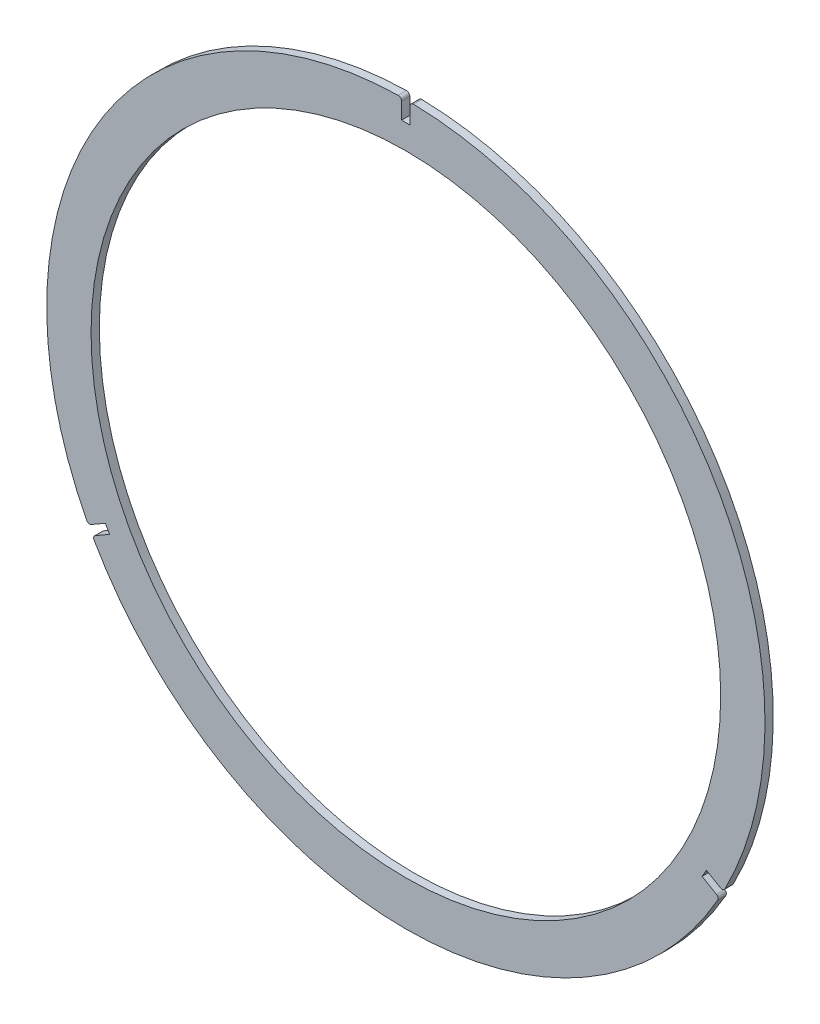
ISO-10303-21;
HEADER;
FILE_DESCRIPTION(('STEP AP214'),'2;1');
FILE_NAME('part.step','',(''),(''),'','','');
FILE_SCHEMA(('AUTOMOTIVE_DESIGN { 1 0 10303 214 1 1 1 1 }'));
ENDSEC;
DATA;
#1=APPLICATION_CONTEXT('core data for automotive mechanical design processes');
#2=APPLICATION_PROTOCOL_DEFINITION('international standard','automotive_design',2000,#1);
#3=PRODUCT_CONTEXT('',#1,'mechanical');
#4=PRODUCT('Part','Part','',(#3));
#5=PRODUCT_RELATED_PRODUCT_CATEGORY('part','',(#4));
#6=PRODUCT_DEFINITION_FORMATION('','',#4);
#7=PRODUCT_DEFINITION_CONTEXT('part definition',#1,'design');
#8=PRODUCT_DEFINITION('design','',#6,#7);
#9=PRODUCT_DEFINITION_SHAPE('','',#8);
#10=(LENGTH_UNIT() NAMED_UNIT(*) SI_UNIT(.MILLI.,.METRE.));
#11=(NAMED_UNIT(*) PLANE_ANGLE_UNIT() SI_UNIT($,.RADIAN.));
#12=(NAMED_UNIT(*) SI_UNIT($,.STERADIAN.) SOLID_ANGLE_UNIT());
#13=UNCERTAINTY_MEASURE_WITH_UNIT(LENGTH_MEASURE(1.E-05),#10,'distance_accuracy_value','');
#14=(GEOMETRIC_REPRESENTATION_CONTEXT(3) GLOBAL_UNCERTAINTY_ASSIGNED_CONTEXT((#13)) GLOBAL_UNIT_ASSIGNED_CONTEXT((#10,
#11,#12)) REPRESENTATION_CONTEXT('',''));
#15=CARTESIAN_POINT('',(0.,0.,0.));
#16=DIRECTION('',(0.,0.,1.));
#17=DIRECTION('',(1.,0.,0.));
#18=AXIS2_PLACEMENT_3D('',#15,#16,#17);
#19=CARTESIAN_POINT('',(8.11058620369085,14.0356499804915,1.5875));
#20=DIRECTION('',(-0.500328450143991,-0.865835689941522,0.));
#21=DIRECTION('',(0.865835689941523,-0.500328450143991,0.));
#22=AXIS2_PLACEMENT_3D('',#19,#20,#21);
#23=PLANE('',#22);
#24=DIRECTION('',(-0.865835689941523,0.500328450143991,0.));
#25=VECTOR('',#24,1.);
#26=CARTESIAN_POINT('',(8.11058620369085,14.0356499804915,-1.5875));
#27=LINE('',#26,#25);
#28=CARTESIAN_POINT('',(120.793813473381,-51.0790422319244,-1.5875));
#29=VERTEX_POINT('',#28);
#30=CARTESIAN_POINT('',(115.417559620864,-47.9723410542541,-1.5875));
#31=VERTEX_POINT('',#30);
#32=EDGE_CURVE('E219',#29,#31,#27,.T.);
#33=ORIENTED_EDGE('',*,*,#32,.F.);
#34=DIRECTION('',(0.,0.,1.));
#35=VECTOR('',#34,1.);
#36=CARTESIAN_POINT('',(120.793813473381,-51.0790422319244,1.5875));
#37=LINE('',#36,#35);
#38=CARTESIAN_POINT('',(120.793813473381,-51.0790422319244,1.5875));
#39=VERTEX_POINT('',#38);
#40=EDGE_CURVE('E301',#29,#39,#37,.T.);
#41=ORIENTED_EDGE('',*,*,#40,.T.);
#42=DIRECTION('',(-0.865835689941523,0.500328450143991,0.));
#43=VECTOR('',#42,1.);
#44=CARTESIAN_POINT('',(8.11058620369085,14.0356499804915,1.5875));
#45=LINE('',#44,#43);
#46=CARTESIAN_POINT('',(115.417559620864,-47.9723410542541,1.5875));
#47=VERTEX_POINT('',#46);
#48=EDGE_CURVE('E358',#39,#47,#45,.T.);
#49=ORIENTED_EDGE('',*,*,#48,.T.);
#50=DIRECTION('',(0.,0.,-1.));
#51=VECTOR('',#50,1.);
#52=CARTESIAN_POINT('',(115.417559620864,-47.9723410542541,1.5875));
#53=LINE('',#52,#51);
#54=EDGE_CURVE('E215',#47,#31,#53,.T.);
#55=ORIENTED_EDGE('',*,*,#54,.T.);
#56=EDGE_LOOP('',(#33,#41,#49,#55));
#57=FACE_BOUND('',#56,.T.);
#58=ADVANCED_FACE('F39',(#57),#23,.T.);
#59=CARTESIAN_POINT('',(0.,12.7,1.5875));
#60=DIRECTION('',(0.,0.,-1.));
#61=DIRECTION('',(-1.,0.,0.));
#62=AXIS2_PLACEMENT_3D('',#59,#60,#61);
#63=CYLINDRICAL_SURFACE('',#62,137.922);
#64=CARTESIAN_POINT('',(0.,12.7,1.5875));
#65=DIRECTION('',(0.,0.,1.));
#66=DIRECTION('',(1.,0.,0.));
#67=AXIS2_PLACEMENT_3D('',#64,#65,#66);
#68=CIRCLE('',#67,137.922);
#69=CARTESIAN_POINT('',(122.557755053066,-50.5619534977591,1.5875));
#70=VERTEX_POINT('',#69);
#71=CARTESIAN_POINT('',(2.9481468401487,150.590487395646,1.5875));
#72=VERTEX_POINT('',#71);
#73=EDGE_CURVE('E188',#70,#72,#68,.T.);
#74=ORIENTED_EDGE('',*,*,#73,.F.);
#75=DIRECTION('',(0.,0.,-1.));
#76=VECTOR('',#75,1.);
#77=CARTESIAN_POINT('',(122.557755053066,-50.5619534977591,1.5875));
#78=LINE('',#77,#76);
#79=CARTESIAN_POINT('',(122.557755053066,-50.5619534977591,-1.5875));
#80=VERTEX_POINT('',#79);
#81=EDGE_CURVE('E298',#70,#80,#78,.T.);
#82=ORIENTED_EDGE('',*,*,#81,.T.);
#83=CARTESIAN_POINT('',(0.,12.7,-1.5875));
#84=DIRECTION('',(0.,0.,1.));
#85=DIRECTION('',(1.,0.,0.));
#86=AXIS2_PLACEMENT_3D('',#83,#84,#85);
#87=CIRCLE('',#86,137.922);
#88=CARTESIAN_POINT('',(2.9481468401487,150.590487395646,-1.5875));
#89=VERTEX_POINT('',#88);
#90=EDGE_CURVE('E221',#80,#89,#87,.T.);
#91=ORIENTED_EDGE('',*,*,#90,.T.);
#92=DIRECTION('',(0.,0.,-1.));
#93=VECTOR('',#92,1.);
#94=CARTESIAN_POINT('',(2.9481468401487,150.590487395646,1.5875));
#95=LINE('',#94,#93);
#96=EDGE_CURVE('E296',#89,#72,#95,.F.);
#97=ORIENTED_EDGE('',*,*,#96,.T.);
#98=EDGE_LOOP('',(#74,#82,#91,#97));
#99=FACE_BOUND('',#98,.T.);
#100=ADVANCED_FACE('F378',(#99),#63,.T.);
#101=CARTESIAN_POINT('',(1.651,0.,1.5875));
#102=DIRECTION('',(-1.,0.,0.));
#103=DIRECTION('',(0.,-1.,0.));
#104=AXIS2_PLACEMENT_3D('',#101,#102,#103);
#105=PLANE('',#104);
#106=DIRECTION('',(0.,1.,0.));
#107=VECTOR('',#106,1.);
#108=CARTESIAN_POINT('',(1.651,0.,1.5875));
#109=LINE('',#108,#107);
#110=CARTESIAN_POINT('',(1.651,142.992117970104,1.5875));
#111=VERTEX_POINT('',#110);
#112=CARTESIAN_POINT('',(1.651,149.320777566957,1.5875));
#113=VERTEX_POINT('',#112);
#114=EDGE_CURVE('E169',#111,#113,#109,.T.);
#115=ORIENTED_EDGE('',*,*,#114,.T.);
#116=DIRECTION('',(0.,0.,1.));
#117=VECTOR('',#116,1.);
#118=CARTESIAN_POINT('',(1.651,149.320777566957,-1.5875));
#119=LINE('',#118,#117);
#120=CARTESIAN_POINT('',(1.651,149.320777566957,-1.5875));
#121=VERTEX_POINT('',#120);
#122=EDGE_CURVE('E47',#113,#121,#119,.F.);
#123=ORIENTED_EDGE('',*,*,#122,.T.);
#124=DIRECTION('',(0.,1.,0.));
#125=VECTOR('',#124,1.);
#126=CARTESIAN_POINT('',(1.651,0.,-1.5875));
#127=LINE('',#126,#125);
#128=CARTESIAN_POINT('',(1.651,142.992117970104,-1.5875));
#129=VERTEX_POINT('',#128);
#130=EDGE_CURVE('E172',#129,#121,#127,.T.);
#131=ORIENTED_EDGE('',*,*,#130,.F.);
#132=DIRECTION('',(0.,0.,-1.));
#133=VECTOR('',#132,1.);
#134=CARTESIAN_POINT('',(1.651,142.992117970104,1.5875));
#135=LINE('',#134,#133);
#136=EDGE_CURVE('E165',#111,#129,#135,.T.);
#137=ORIENTED_EDGE('',*,*,#136,.F.);
#138=EDGE_LOOP('',(#115,#123,#131,#137));
#139=FACE_BOUND('',#138,.T.);
#140=ADVANCED_FACE('F167',(#139),#105,.T.);
#141=CARTESIAN_POINT('',(0.,142.992117970104,1.5875));
#142=DIRECTION('',(0.,1.,0.));
#143=DIRECTION('',(0.,0.,1.));
#144=AXIS2_PLACEMENT_3D('',#141,#142,#143);
#145=PLANE('',#144);
#146=DIRECTION('',(1.,0.,0.));
#147=VECTOR('',#146,1.);
#148=CARTESIAN_POINT('',(0.,142.992117970104,-1.5875));
#149=LINE('',#148,#147);
#150=CARTESIAN_POINT('',(-1.651,142.992117970104,-1.5875));
#151=VERTEX_POINT('',#150);
#152=EDGE_CURVE('E225',#151,#129,#149,.T.);
#153=ORIENTED_EDGE('',*,*,#152,.F.);
#154=DIRECTION('',(0.,0.,-1.));
#155=VECTOR('',#154,1.);
#156=CARTESIAN_POINT('',(-1.651,142.992117970104,1.5875));
#157=LINE('',#156,#155);
#158=CARTESIAN_POINT('',(-1.651,142.992117970104,1.5875));
#159=VERTEX_POINT('',#158);
#160=EDGE_CURVE('E178',#159,#151,#157,.T.);
#161=ORIENTED_EDGE('',*,*,#160,.F.);
#162=DIRECTION('',(1.,0.,0.));
#163=VECTOR('',#162,1.);
#164=CARTESIAN_POINT('',(0.,142.992117970104,1.5875));
#165=LINE('',#164,#163);
#166=EDGE_CURVE('E184',#159,#111,#165,.T.);
#167=ORIENTED_EDGE('',*,*,#166,.T.);
#168=ORIENTED_EDGE('',*,*,#136,.T.);
#169=EDGE_LOOP('',(#153,#161,#167,#168));
#170=FACE_BOUND('',#169,.T.);
#171=ADVANCED_FACE('F190',(#170),#145,.T.);
#172=CARTESIAN_POINT('',(-1.651,0.,1.5875));
#173=DIRECTION('',(-1.,0.,0.));
#174=DIRECTION('',(0.,-1.,0.));
#175=AXIS2_PLACEMENT_3D('',#172,#173,#174);
#176=PLANE('',#175);
#177=DIRECTION('',(0.,1.,0.));
#178=VECTOR('',#177,1.);
#179=CARTESIAN_POINT('',(-1.651,0.,-1.5875));
#180=LINE('',#179,#178);
#181=CARTESIAN_POINT('',(-1.651,149.320777566957,-1.5875));
#182=VERTEX_POINT('',#181);
#183=EDGE_CURVE('E227',#151,#182,#180,.T.);
#184=ORIENTED_EDGE('',*,*,#183,.T.);
#185=DIRECTION('',(0.,0.,-1.));
#186=VECTOR('',#185,1.);
#187=CARTESIAN_POINT('',(-1.651,149.320777566957,1.5875));
#188=LINE('',#187,#186);
#189=CARTESIAN_POINT('',(-1.651,149.320777566957,1.5875));
#190=VERTEX_POINT('',#189);
#191=EDGE_CURVE('E11',#182,#190,#188,.F.);
#192=ORIENTED_EDGE('',*,*,#191,.T.);
#193=DIRECTION('',(0.,1.,0.));
#194=VECTOR('',#193,1.);
#195=CARTESIAN_POINT('',(-1.651,0.,1.5875));
#196=LINE('',#195,#194);
#197=EDGE_CURVE('E192',#159,#190,#196,.T.);
#198=ORIENTED_EDGE('',*,*,#197,.F.);
#199=ORIENTED_EDGE('',*,*,#160,.T.);
#200=EDGE_LOOP('',(#184,#192,#198,#199));
#201=FACE_BOUND('',#200,.T.);
#202=ADVANCED_FACE('F313',(#201),#176,.F.);
#203=CARTESIAN_POINT('',(0.,12.7,1.5875));
#204=DIRECTION('',(0.,0.,-1.));
#205=DIRECTION('',(-1.,0.,0.));
#206=AXIS2_PLACEMENT_3D('',#203,#204,#205);
#207=CYLINDRICAL_SURFACE('',#206,137.922);
#208=CARTESIAN_POINT('',(0.,12.7,-1.5875));
#209=DIRECTION('',(0.,0.,1.));
#210=DIRECTION('',(1.,0.,0.));
#211=AXIS2_PLACEMENT_3D('',#208,#209,#210);
#212=CIRCLE('',#211,137.922);
#213=CARTESIAN_POINT('',(-2.9481468401487,150.590487395646,-1.5875));
#214=VERTEX_POINT('',#213);
#215=CARTESIAN_POINT('',(-122.560886296472,-50.5558869530989,-1.5875));
#216=VERTEX_POINT('',#215);
#217=EDGE_CURVE('E230',#214,#216,#212,.T.);
#218=ORIENTED_EDGE('',*,*,#217,.T.);
#219=DIRECTION('',(0.,0.,-1.));
#220=VECTOR('',#219,1.);
#221=CARTESIAN_POINT('',(-122.560886296472,-50.5558869530989,1.5875));
#222=LINE('',#221,#220);
#223=CARTESIAN_POINT('',(-122.560886296472,-50.5558869530989,1.5875));
#224=VERTEX_POINT('',#223);
#225=EDGE_CURVE('E278',#216,#224,#222,.F.);
#226=ORIENTED_EDGE('',*,*,#225,.T.);
#227=CARTESIAN_POINT('',(0.,12.7,1.5875));
#228=DIRECTION('',(0.,0.,1.));
#229=DIRECTION('',(1.,0.,0.));
#230=AXIS2_PLACEMENT_3D('',#227,#228,#229);
#231=CIRCLE('',#230,137.922);
#232=CARTESIAN_POINT('',(-2.9481468401487,150.590487395646,1.5875));
#233=VERTEX_POINT('',#232);
#234=EDGE_CURVE('E194',#233,#224,#231,.T.);
#235=ORIENTED_EDGE('',*,*,#234,.F.);
#236=DIRECTION('',(0.,0.,-1.));
#237=VECTOR('',#236,1.);
#238=CARTESIAN_POINT('',(-2.9481468401487,150.590487395646,1.5875));
#239=LINE('',#238,#237);
#240=EDGE_CURVE('E275',#233,#214,#239,.T.);
#241=ORIENTED_EDGE('',*,*,#240,.T.);
#242=EDGE_LOOP('',(#218,#226,#235,#241));
#243=FACE_BOUND('',#242,.T.);
#244=ADVANCED_FACE('F320',(#243),#207,.T.);
#245=CARTESIAN_POINT('',(-8.109964379267,14.0362122157648,1.5875));
#246=DIRECTION('',(0.500284668198708,-0.865860988129913,0.));
#247=DIRECTION('',(0.865860988129913,0.500284668198708,0.));
#248=AXIS2_PLACEMENT_3D('',#245,#246,#247);
#249=PLANE('',#248);
#250=DIRECTION('',(-0.865860988129913,-0.500284668198708,0.));
#251=VECTOR('',#250,1.);
#252=CARTESIAN_POINT('',(-8.109964379267,14.0362122157648,1.5875));
#253=LINE('',#252,#251);
#254=CARTESIAN_POINT('',(-115.420556309738,-47.9666319060074,1.5875));
#255=VERTEX_POINT('',#254);
#256=CARTESIAN_POINT('',(-120.796971487045,-51.0730636773324,1.5875));
#257=VERTEX_POINT('',#256);
#258=EDGE_CURVE('E199',#255,#257,#253,.T.);
#259=ORIENTED_EDGE('',*,*,#258,.T.);
#260=DIRECTION('',(0.,0.,1.));
#261=VECTOR('',#260,1.);
#262=CARTESIAN_POINT('',(-120.796971487045,-51.0730636773324,-1.5875));
#263=LINE('',#262,#261);
#264=CARTESIAN_POINT('',(-120.796971487045,-51.0730636773324,-1.5875));
#265=VERTEX_POINT('',#264);
#266=EDGE_CURVE('E177',#257,#265,#263,.F.);
#267=ORIENTED_EDGE('',*,*,#266,.T.);
#268=DIRECTION('',(-0.865860988129913,-0.500284668198708,0.));
#269=VECTOR('',#268,1.);
#270=CARTESIAN_POINT('',(-8.109964379267,14.0362122157648,-1.5875));
#271=LINE('',#270,#269);
#272=CARTESIAN_POINT('',(-115.420556309738,-47.9666319060074,-1.5875));
#273=VERTEX_POINT('',#272);
#274=EDGE_CURVE('E233',#273,#265,#271,.T.);
#275=ORIENTED_EDGE('',*,*,#274,.F.);
#276=DIRECTION('',(0.,0.,-1.));
#277=VECTOR('',#276,1.);
#278=CARTESIAN_POINT('',(-115.420556309738,-47.9666319060074,1.5875));
#279=LINE('',#278,#277);
#280=EDGE_CURVE('E258',#255,#273,#279,.T.);
#281=ORIENTED_EDGE('',*,*,#280,.F.);
#282=EDGE_LOOP('',(#259,#267,#275,#281));
#283=FACE_BOUND('',#282,.T.);
#284=ADVANCED_FACE('F327',(#283),#249,.T.);
#285=CARTESIAN_POINT('',(-107.310591930471,-62.0028441217715,1.5875));
#286=DIRECTION('',(0.865860988129916,0.500284668198702,0.));
#287=DIRECTION('',(-0.500284668198702,0.865860988129916,0.));
#288=AXIS2_PLACEMENT_3D('',#285,#286,#287);
#289=PLANE('',#288);
#290=DIRECTION('',(0.500284668198702,-0.865860988129916,0.));
#291=VECTOR('',#290,1.);
#292=CARTESIAN_POINT('',(-107.310591930471,-62.0028441217715,-1.5875));
#293=LINE('',#292,#291);
#294=CARTESIAN_POINT('',(-113.768616335346,-50.8257048888123,-1.5875));
#295=VERTEX_POINT('',#294);
#296=EDGE_CURVE('E236',#273,#295,#293,.T.);
#297=ORIENTED_EDGE('',*,*,#296,.T.);
#298=DIRECTION('',(0.,0.,-1.));
#299=VECTOR('',#298,1.);
#300=CARTESIAN_POINT('',(-113.768616335346,-50.8257048888123,1.5875));
#301=LINE('',#300,#299);
#302=CARTESIAN_POINT('',(-113.768616335346,-50.8257048888123,1.5875));
#303=VERTEX_POINT('',#302);
#304=EDGE_CURVE('E255',#303,#295,#301,.T.);
#305=ORIENTED_EDGE('',*,*,#304,.F.);
#306=DIRECTION('',(0.500284668198702,-0.865860988129916,0.));
#307=VECTOR('',#306,1.);
#308=CARTESIAN_POINT('',(-107.310591930471,-62.0028441217715,1.5875));
#309=LINE('',#308,#307);
#310=EDGE_CURVE('E202',#255,#303,#309,.T.);
#311=ORIENTED_EDGE('',*,*,#310,.F.);
#312=ORIENTED_EDGE('',*,*,#280,.T.);
#313=EDGE_LOOP('',(#297,#305,#311,#312));
#314=FACE_BOUND('',#313,.T.);
#315=ADVANCED_FACE('F333',(#314),#289,.F.);
#316=CARTESIAN_POINT('',(-6.45802440487518,11.1771392329602,1.5875));
#317=DIRECTION('',(0.500284668198711,-0.865860988129911,0.));
#318=DIRECTION('',(0.865860988129911,0.500284668198711,0.));
#319=AXIS2_PLACEMENT_3D('',#316,#317,#318);
#320=PLANE('',#319);
#321=DIRECTION('',(-0.865860988129911,-0.500284668198711,0.));
#322=VECTOR('',#321,1.);
#323=CARTESIAN_POINT('',(-6.45802440487518,11.1771392329602,-1.5875));
#324=LINE('',#323,#322);
#325=CARTESIAN_POINT('',(-119.277005673374,-54.008389834853,-1.5875));
#326=VERTEX_POINT('',#325);
#327=EDGE_CURVE('E239',#295,#326,#324,.T.);
#328=ORIENTED_EDGE('',*,*,#327,.T.);
#329=DIRECTION('',(0.,0.,-1.));
#330=VECTOR('',#329,1.);
#331=CARTESIAN_POINT('',(-119.277005673374,-54.008389834853,1.5875));
#332=LINE('',#331,#330);
#333=CARTESIAN_POINT('',(-119.277005673374,-54.008389834853,1.5875));
#334=VERTEX_POINT('',#333);
#335=EDGE_CURVE('E294',#326,#334,#332,.F.);
#336=ORIENTED_EDGE('',*,*,#335,.T.);
#337=DIRECTION('',(-0.865860988129911,-0.500284668198711,0.));
#338=VECTOR('',#337,1.);
#339=CARTESIAN_POINT('',(-6.45802440487518,11.1771392329602,1.5875));
#340=LINE('',#339,#338);
#341=EDGE_CURVE('E205',#303,#334,#340,.T.);
#342=ORIENTED_EDGE('',*,*,#341,.F.);
#343=ORIENTED_EDGE('',*,*,#304,.T.);
#344=EDGE_LOOP('',(#328,#336,#342,#343));
#345=FACE_BOUND('',#344,.T.);
#346=ADVANCED_FACE('F474',(#345),#320,.F.);
#347=CARTESIAN_POINT('',(0.,12.7,1.5875));
#348=DIRECTION('',(0.,0.,-1.));
#349=DIRECTION('',(-1.,0.,0.));
#350=AXIS2_PLACEMENT_3D('',#347,#348,#349);
#351=CYLINDRICAL_SURFACE('',#350,137.922);
#352=CARTESIAN_POINT('',(0.,12.7,1.5875));
#353=DIRECTION('',(0.,0.,1.));
#354=DIRECTION('',(1.,0.,0.));
#355=AXIS2_PLACEMENT_3D('',#352,#353,#354);
#356=CIRCLE('',#355,137.922);
#357=CARTESIAN_POINT('',(-119.744261655401,-55.7382194727685,1.5875));
#358=VERTEX_POINT('',#357);
#359=CARTESIAN_POINT('',(119.740873814555,-55.7441467338644,1.5875));
#360=VERTEX_POINT('',#359);
#361=EDGE_CURVE('E208',#358,#360,#356,.T.);
#362=ORIENTED_EDGE('',*,*,#361,.F.);
#363=DIRECTION('',(0.,0.,-1.));
#364=VECTOR('',#363,1.);
#365=CARTESIAN_POINT('',(-119.744261655401,-55.7382194727685,1.5875));
#366=LINE('',#365,#364);
#367=CARTESIAN_POINT('',(-119.744261655401,-55.7382194727685,-1.5875));
#368=VERTEX_POINT('',#367);
#369=EDGE_CURVE('E291',#358,#368,#366,.T.);
#370=ORIENTED_EDGE('',*,*,#369,.T.);
#371=CARTESIAN_POINT('',(0.,12.7,-1.5875));
#372=DIRECTION('',(0.,0.,1.));
#373=DIRECTION('',(1.,0.,0.));
#374=AXIS2_PLACEMENT_3D('',#371,#372,#373);
#375=CIRCLE('',#374,137.922);
#376=CARTESIAN_POINT('',(119.740873814555,-55.7441467338644,-1.5875));
#377=VERTEX_POINT('',#376);
#378=EDGE_CURVE('E242',#368,#377,#375,.T.);
#379=ORIENTED_EDGE('',*,*,#378,.T.);
#380=DIRECTION('',(0.,0.,-1.));
#381=VECTOR('',#380,1.);
#382=CARTESIAN_POINT('',(119.740873814555,-55.7441467338644,1.5875));
#383=LINE('',#382,#381);
#384=EDGE_CURVE('E62',#377,#360,#383,.F.);
#385=ORIENTED_EDGE('',*,*,#384,.T.);
#386=EDGE_LOOP('',(#362,#370,#379,#385));
#387=FACE_BOUND('',#386,.T.);
#388=ADVANCED_FACE('F341',(#387),#351,.T.);
#389=CARTESIAN_POINT('',(6.45850166131615,11.1766605323057,1.5875));
#390=DIRECTION('',(-0.500328450143999,-0.865835689941517,0.));
#391=DIRECTION('',(0.865835689941517,-0.500328450143999,0.));
#392=AXIS2_PLACEMENT_3D('',#389,#390,#391);
#393=PLANE('',#392);
#394=DIRECTION('',(-0.865835689941517,0.500328450143999,0.));
#395=VECTOR('',#394,1.);
#396=CARTESIAN_POINT('',(6.45850166131615,11.1766605323057,1.5875));
#397=LINE('',#396,#395);
#398=CARTESIAN_POINT('',(119.273704631187,-54.0142946458168,1.5875));
#399=VERTEX_POINT('',#398);
#400=CARTESIAN_POINT('',(113.765475078489,-50.831330502441,1.5875));
#401=VERTEX_POINT('',#400);
#402=EDGE_CURVE('E210',#399,#401,#397,.T.);
#403=ORIENTED_EDGE('',*,*,#402,.F.);
#404=DIRECTION('',(0.,0.,-1.));
#405=VECTOR('',#404,1.);
#406=CARTESIAN_POINT('',(119.273704631187,-54.0142946458168,1.5875));
#407=LINE('',#406,#405);
#408=CARTESIAN_POINT('',(119.273704631187,-54.0142946458168,-1.5875));
#409=VERTEX_POINT('',#408);
#410=EDGE_CURVE('E303',#399,#409,#407,.T.);
#411=ORIENTED_EDGE('',*,*,#410,.T.);
#412=DIRECTION('',(-0.865835689941517,0.500328450143999,0.));
#413=VECTOR('',#412,1.);
#414=CARTESIAN_POINT('',(6.45850166131615,11.1766605323057,-1.5875));
#415=LINE('',#414,#413);
#416=CARTESIAN_POINT('',(113.765475078489,-50.831330502441,-1.5875));
#417=VERTEX_POINT('',#416);
#418=EDGE_CURVE('E244',#409,#417,#415,.T.);
#419=ORIENTED_EDGE('',*,*,#418,.T.);
#420=DIRECTION('',(0.,0.,-1.));
#421=VECTOR('',#420,1.);
#422=CARTESIAN_POINT('',(113.765475078489,-50.831330502441,1.5875));
#423=LINE('',#422,#421);
#424=EDGE_CURVE('E252',#401,#417,#423,.T.);
#425=ORIENTED_EDGE('',*,*,#424,.F.);
#426=EDGE_LOOP('',(#403,#411,#419,#425));
#427=FACE_BOUND('',#426,.T.);
#428=ADVANCED_FACE('F348',(#427),#393,.F.);
#429=CARTESIAN_POINT('',(0.,12.7,1.5875));
#430=DIRECTION('',(0.,0.,-1.));
#431=DIRECTION('',(-1.,0.,0.));
#432=AXIS2_PLACEMENT_3D('',#429,#430,#431);
#433=CYLINDRICAL_SURFACE('',#432,120.904);
#434=CARTESIAN_POINT('',(0.,12.7,1.5875));
#435=DIRECTION('',(0.,0.,1.));
#436=DIRECTION('',(1.,0.,0.));
#437=AXIS2_PLACEMENT_3D('',#434,#435,#436);
#438=CIRCLE('',#437,120.904);
#439=CARTESIAN_POINT('',(120.904,12.7,1.5875));
#440=VERTEX_POINT('',#439);
#441=EDGE_CURVE('E249',#440,#440,#438,.T.);
#442=ORIENTED_EDGE('',*,*,#441,.T.);
#443=EDGE_LOOP('',(#442));
#444=FACE_BOUND('',#443,.T.);
#445=CARTESIAN_POINT('',(0.,12.7,-1.5875));
#446=DIRECTION('',(0.,0.,1.));
#447=DIRECTION('',(1.,0.,0.));
#448=AXIS2_PLACEMENT_3D('',#445,#446,#447);
#449=CIRCLE('',#448,120.904);
#450=CARTESIAN_POINT('',(120.904,12.7,-1.5875));
#451=VERTEX_POINT('',#450);
#452=EDGE_CURVE('E216',#451,#451,#449,.T.);
#453=ORIENTED_EDGE('',*,*,#452,.F.);
#454=EDGE_LOOP('',(#453));
#455=FACE_BOUND('',#454,.T.);
#456=ADVANCED_FACE('F365',(#444,#455),#433,.F.);
#457=CARTESIAN_POINT('',(107.306973417173,-62.0079910347456,1.5875));
#458=DIRECTION('',(-0.865835689941523,0.50032845014399,0.));
#459=DIRECTION('',(-0.50032845014399,-0.865835689941523,0.));
#460=AXIS2_PLACEMENT_3D('',#457,#458,#459);
#461=PLANE('',#460);
#462=DIRECTION('',(0.50032845014399,0.865835689941523,0.));
#463=VECTOR('',#462,1.);
#464=CARTESIAN_POINT('',(107.306973417173,-62.0079910347456,-1.5875));
#465=LINE('',#464,#463);
#466=EDGE_CURVE('E246',#417,#31,#465,.T.);
#467=ORIENTED_EDGE('',*,*,#466,.T.);
#468=ORIENTED_EDGE('',*,*,#54,.F.);
#469=DIRECTION('',(0.50032845014399,0.865835689941523,0.));
#470=VECTOR('',#469,1.);
#471=CARTESIAN_POINT('',(107.306973417173,-62.0079910347456,1.5875));
#472=LINE('',#471,#470);
#473=EDGE_CURVE('E212',#401,#47,#472,.T.);
#474=ORIENTED_EDGE('',*,*,#473,.F.);
#475=ORIENTED_EDGE('',*,*,#424,.T.);
#476=EDGE_LOOP('',(#467,#468,#474,#475));
#477=FACE_BOUND('',#476,.T.);
#478=ADVANCED_FACE('F354',(#477),#461,.F.);
#479=CARTESIAN_POINT('',(0.,0.,1.5875));
#480=DIRECTION('',(0.,0.,1.));
#481=DIRECTION('',(1.,0.,0.));
#482=AXIS2_PLACEMENT_3D('',#479,#480,#481);
#483=PLANE('',#482);
#484=ORIENTED_EDGE('',*,*,#441,.F.);
#485=EDGE_LOOP('',(#484));
#486=FACE_BOUND('',#485,.T.);
#487=ORIENTED_EDGE('',*,*,#234,.T.);
#488=CARTESIAN_POINT('',(-121.432333015657,-49.9734202224074,1.5875));
#489=DIRECTION('',(0.,0.,1.));
#490=DIRECTION('',(1.,0.,0.));
#491=AXIS2_PLACEMENT_3D('',#488,#489,#490);
#492=CIRCLE('',#491,1.27);
#493=EDGE_CURVE('E288',#224,#257,#492,.T.);
#494=ORIENTED_EDGE('',*,*,#493,.T.);
#495=ORIENTED_EDGE('',*,*,#258,.F.);
#496=ORIENTED_EDGE('',*,*,#310,.T.);
#497=ORIENTED_EDGE('',*,*,#341,.T.);
#498=CARTESIAN_POINT('',(-118.641644144762,-55.108033289778,1.5875));
#499=DIRECTION('',(0.,0.,1.));
#500=DIRECTION('',(1.,0.,0.));
#501=AXIS2_PLACEMENT_3D('',#498,#499,#500);
#502=CIRCLE('',#501,1.27);
#503=EDGE_CURVE('E286',#334,#358,#502,.T.);
#504=ORIENTED_EDGE('',*,*,#503,.T.);
#505=ORIENTED_EDGE('',*,*,#361,.T.);
#506=CARTESIAN_POINT('',(118.638287499504,-55.1139059720425,1.5875));
#507=DIRECTION('',(0.,0.,1.));
#508=DIRECTION('',(1.,0.,0.));
#509=AXIS2_PLACEMENT_3D('',#506,#507,#508);
#510=CIRCLE('',#509,1.27);
#511=EDGE_CURVE('E54',#360,#399,#510,.T.);
#512=ORIENTED_EDGE('',*,*,#511,.T.);
#513=ORIENTED_EDGE('',*,*,#402,.T.);
#514=ORIENTED_EDGE('',*,*,#473,.T.);
#515=ORIENTED_EDGE('',*,*,#48,.F.);
#516=CARTESIAN_POINT('',(121.429230605064,-49.9794309056987,1.5875));
#517=DIRECTION('',(0.,0.,1.));
#518=DIRECTION('',(1.,0.,0.));
#519=AXIS2_PLACEMENT_3D('',#516,#517,#518);
#520=CIRCLE('',#519,1.27);
#521=EDGE_CURVE('E284',#39,#70,#520,.T.);
#522=ORIENTED_EDGE('',*,*,#521,.T.);
#523=ORIENTED_EDGE('',*,*,#73,.T.);
#524=CARTESIAN_POINT('',(2.921,149.320777566957,1.5875));
#525=DIRECTION('',(0.,0.,1.));
#526=DIRECTION('',(1.,0.,0.));
#527=AXIS2_PLACEMENT_3D('',#524,#525,#526);
#528=CIRCLE('',#527,1.27);
#529=EDGE_CURVE('E187',#72,#113,#528,.T.);
#530=ORIENTED_EDGE('',*,*,#529,.T.);
#531=ORIENTED_EDGE('',*,*,#114,.F.);
#532=ORIENTED_EDGE('',*,*,#166,.F.);
#533=ORIENTED_EDGE('',*,*,#197,.T.);
#534=CARTESIAN_POINT('',(-2.921,149.320777566957,1.5875));
#535=DIRECTION('',(0.,0.,1.));
#536=DIRECTION('',(1.,0.,0.));
#537=AXIS2_PLACEMENT_3D('',#534,#535,#536);
#538=CIRCLE('',#537,1.27);
#539=EDGE_CURVE('E280',#190,#233,#538,.T.);
#540=ORIENTED_EDGE('',*,*,#539,.T.);
#541=EDGE_LOOP('',(#487,#494,#495,#496,#497,#504,#505,#512,#513,#514,#515,#522,#523,#530,#531,
#532,#533,#540));
#542=FACE_BOUND('',#541,.T.);
#543=ADVANCED_FACE('F182',(#486,#542),#483,.T.);
#544=CARTESIAN_POINT('',(0.,0.,-1.5875));
#545=DIRECTION('',(0.,0.,1.));
#546=DIRECTION('',(1.,0.,0.));
#547=AXIS2_PLACEMENT_3D('',#544,#545,#546);
#548=PLANE('',#547);
#549=ORIENTED_EDGE('',*,*,#452,.T.);
#550=EDGE_LOOP('',(#549));
#551=FACE_BOUND('',#550,.T.);
#552=ORIENTED_EDGE('',*,*,#274,.T.);
#553=CARTESIAN_POINT('',(-121.432333015657,-49.9734202224074,-1.5875));
#554=DIRECTION('',(0.,0.,1.));
#555=DIRECTION('',(1.,0.,0.));
#556=AXIS2_PLACEMENT_3D('',#553,#554,#555);
#557=CIRCLE('',#556,1.27);
#558=EDGE_CURVE('E273',#265,#216,#557,.F.);
#559=ORIENTED_EDGE('',*,*,#558,.T.);
#560=ORIENTED_EDGE('',*,*,#217,.F.);
#561=CARTESIAN_POINT('',(-2.921,149.320777566957,-1.5875));
#562=DIRECTION('',(0.,0.,1.));
#563=DIRECTION('',(1.,0.,0.));
#564=AXIS2_PLACEMENT_3D('',#561,#562,#563);
#565=CIRCLE('',#564,1.27);
#566=EDGE_CURVE('E263',#214,#182,#565,.F.);
#567=ORIENTED_EDGE('',*,*,#566,.T.);
#568=ORIENTED_EDGE('',*,*,#183,.F.);
#569=ORIENTED_EDGE('',*,*,#152,.T.);
#570=ORIENTED_EDGE('',*,*,#130,.T.);
#571=CARTESIAN_POINT('',(2.921,149.320777566957,-1.5875));
#572=DIRECTION('',(0.,0.,1.));
#573=DIRECTION('',(1.,0.,0.));
#574=AXIS2_PLACEMENT_3D('',#571,#572,#573);
#575=CIRCLE('',#574,1.27);
#576=EDGE_CURVE('E265',#121,#89,#575,.F.);
#577=ORIENTED_EDGE('',*,*,#576,.T.);
#578=ORIENTED_EDGE('',*,*,#90,.F.);
#579=CARTESIAN_POINT('',(121.429230605064,-49.9794309056987,-1.5875));
#580=DIRECTION('',(0.,0.,1.));
#581=DIRECTION('',(1.,0.,0.));
#582=AXIS2_PLACEMENT_3D('',#579,#580,#581);
#583=CIRCLE('',#582,1.27);
#584=EDGE_CURVE('E269',#80,#29,#583,.F.);
#585=ORIENTED_EDGE('',*,*,#584,.T.);
#586=ORIENTED_EDGE('',*,*,#32,.T.);
#587=ORIENTED_EDGE('',*,*,#466,.F.);
#588=ORIENTED_EDGE('',*,*,#418,.F.);
#589=CARTESIAN_POINT('',(118.638287499504,-55.1139059720425,-1.5875));
#590=DIRECTION('',(0.,0.,1.));
#591=DIRECTION('',(1.,0.,0.));
#592=AXIS2_PLACEMENT_3D('',#589,#590,#591);
#593=CIRCLE('',#592,1.27);
#594=EDGE_CURVE('E267',#409,#377,#593,.F.);
#595=ORIENTED_EDGE('',*,*,#594,.T.);
#596=ORIENTED_EDGE('',*,*,#378,.F.);
#597=CARTESIAN_POINT('',(-118.641644144762,-55.108033289778,-1.5875));
#598=DIRECTION('',(0.,0.,1.));
#599=DIRECTION('',(1.,0.,0.));
#600=AXIS2_PLACEMENT_3D('',#597,#598,#599);
#601=CIRCLE('',#600,1.27);
#602=EDGE_CURVE('E271',#368,#326,#601,.F.);
#603=ORIENTED_EDGE('',*,*,#602,.T.);
#604=ORIENTED_EDGE('',*,*,#327,.F.);
#605=ORIENTED_EDGE('',*,*,#296,.F.);
#606=EDGE_LOOP('',(#552,#559,#560,#567,#568,#569,#570,#577,#578,#585,#586,#587,#588,#595,#596,
#603,#604,#605));
#607=FACE_BOUND('',#606,.T.);
#608=ADVANCED_FACE('F307',(#551,#607),#548,.F.);
#609=CARTESIAN_POINT('',(-121.432333015657,-49.9734202224074,1.5875));
#610=DIRECTION('',(0.,0.,-1.));
#611=DIRECTION('',(-1.,0.,0.));
#612=AXIS2_PLACEMENT_3D('',#609,#610,#611);
#613=CYLINDRICAL_SURFACE('',#612,1.27);
#614=ORIENTED_EDGE('',*,*,#493,.F.);
#615=ORIENTED_EDGE('',*,*,#225,.F.);
#616=ORIENTED_EDGE('',*,*,#558,.F.);
#617=ORIENTED_EDGE('',*,*,#266,.F.);
#618=EDGE_LOOP('',(#614,#615,#616,#617));
#619=FACE_BOUND('',#618,.T.);
#620=ADVANCED_FACE('F323',(#619),#613,.T.);
#621=CARTESIAN_POINT('',(-118.641644144762,-55.108033289778,1.5875));
#622=DIRECTION('',(0.,0.,-1.));
#623=DIRECTION('',(-1.,0.,0.));
#624=AXIS2_PLACEMENT_3D('',#621,#622,#623);
#625=CYLINDRICAL_SURFACE('',#624,1.27);
#626=ORIENTED_EDGE('',*,*,#503,.F.);
#627=ORIENTED_EDGE('',*,*,#335,.F.);
#628=ORIENTED_EDGE('',*,*,#602,.F.);
#629=ORIENTED_EDGE('',*,*,#369,.F.);
#630=EDGE_LOOP('',(#626,#627,#628,#629));
#631=FACE_BOUND('',#630,.T.);
#632=ADVANCED_FACE('F339',(#631),#625,.T.);
#633=CARTESIAN_POINT('',(121.429230605064,-49.9794309056987,1.5875));
#634=DIRECTION('',(0.,0.,-1.));
#635=DIRECTION('',(-1.,0.,0.));
#636=AXIS2_PLACEMENT_3D('',#633,#634,#635);
#637=CYLINDRICAL_SURFACE('',#636,1.27);
#638=ORIENTED_EDGE('',*,*,#521,.F.);
#639=ORIENTED_EDGE('',*,*,#40,.F.);
#640=ORIENTED_EDGE('',*,*,#584,.F.);
#641=ORIENTED_EDGE('',*,*,#81,.F.);
#642=EDGE_LOOP('',(#638,#639,#640,#641));
#643=FACE_BOUND('',#642,.T.);
#644=ADVANCED_FACE('F393',(#643),#637,.T.);
#645=CARTESIAN_POINT('',(118.638287499504,-55.1139059720425,1.5875));
#646=DIRECTION('',(0.,0.,-1.));
#647=DIRECTION('',(-1.,0.,0.));
#648=AXIS2_PLACEMENT_3D('',#645,#646,#647);
#649=CYLINDRICAL_SURFACE('',#648,1.27);
#650=ORIENTED_EDGE('',*,*,#511,.F.);
#651=ORIENTED_EDGE('',*,*,#384,.F.);
#652=ORIENTED_EDGE('',*,*,#594,.F.);
#653=ORIENTED_EDGE('',*,*,#410,.F.);
#654=EDGE_LOOP('',(#650,#651,#652,#653));
#655=FACE_BOUND('',#654,.T.);
#656=ADVANCED_FACE('F346',(#655),#649,.T.);
#657=CARTESIAN_POINT('',(2.921,149.320777566957,1.5875));
#658=DIRECTION('',(0.,0.,-1.));
#659=DIRECTION('',(-1.,0.,0.));
#660=AXIS2_PLACEMENT_3D('',#657,#658,#659);
#661=CYLINDRICAL_SURFACE('',#660,1.27);
#662=ORIENTED_EDGE('',*,*,#529,.F.);
#663=ORIENTED_EDGE('',*,*,#96,.F.);
#664=ORIENTED_EDGE('',*,*,#576,.F.);
#665=ORIENTED_EDGE('',*,*,#122,.F.);
#666=EDGE_LOOP('',(#662,#663,#664,#665));
#667=FACE_BOUND('',#666,.T.);
#668=ADVANCED_FACE('F398',(#667),#661,.T.);
#669=CARTESIAN_POINT('',(-2.921,149.320777566957,1.5875));
#670=DIRECTION('',(0.,0.,-1.));
#671=DIRECTION('',(-1.,0.,0.));
#672=AXIS2_PLACEMENT_3D('',#669,#670,#671);
#673=CYLINDRICAL_SURFACE('',#672,1.27);
#674=ORIENTED_EDGE('',*,*,#539,.F.);
#675=ORIENTED_EDGE('',*,*,#191,.F.);
#676=ORIENTED_EDGE('',*,*,#566,.F.);
#677=ORIENTED_EDGE('',*,*,#240,.F.);
#678=EDGE_LOOP('',(#674,#675,#676,#677));
#679=FACE_BOUND('',#678,.T.);
#680=ADVANCED_FACE('F41',(#679),#673,.T.);
#681=CLOSED_SHELL('',(#58,#100,#140,#171,#202,#244,#284,#315,#346,#388,#428,#456,#478,#543,#608,
#620,#632,#644,#656,#668,#680));
#682=MANIFOLD_SOLID_BREP('B2',#681);
#683=ADVANCED_BREP_SHAPE_REPRESENTATION('',(#18,#682),#14);
#684=SHAPE_DEFINITION_REPRESENTATION(#9,#683);
ENDSEC;
END-ISO-10303-21;
